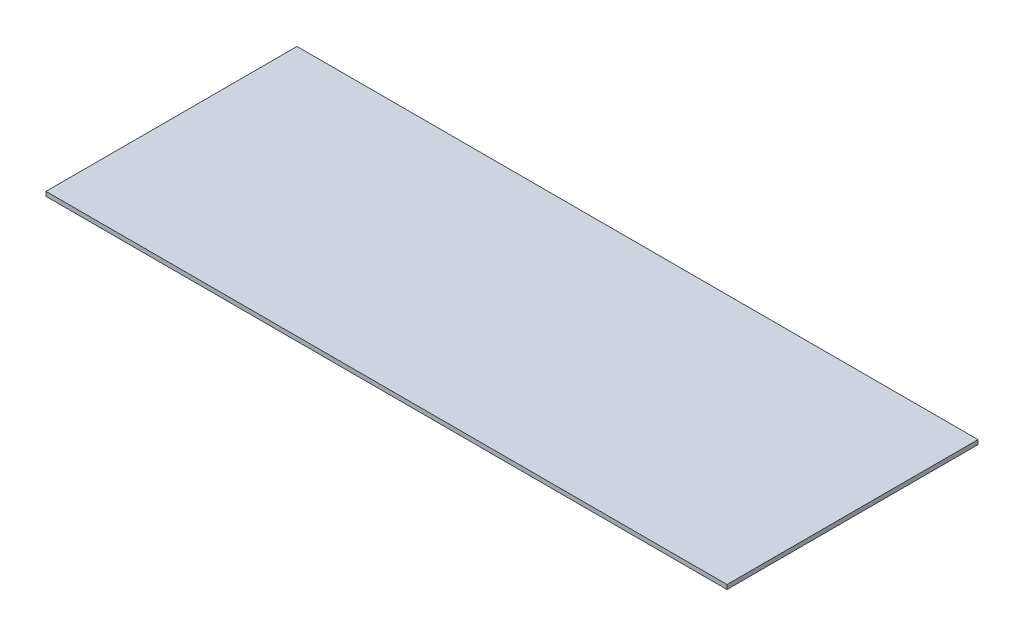
ISO-10303-21;
HEADER;
FILE_DESCRIPTION(('STEP AP214'),'2;1');
FILE_NAME('part.step','',(''),(''),'','','');
FILE_SCHEMA(('AUTOMOTIVE_DESIGN { 1 0 10303 214 1 1 1 1 }'));
ENDSEC;
DATA;
#1=APPLICATION_CONTEXT('core data for automotive mechanical design processes');
#2=APPLICATION_PROTOCOL_DEFINITION('international standard','automotive_design',2000,#1);
#3=PRODUCT_CONTEXT('',#1,'mechanical');
#4=PRODUCT('Part','Part','',(#3));
#5=PRODUCT_RELATED_PRODUCT_CATEGORY('part','',(#4));
#6=PRODUCT_DEFINITION_FORMATION('','',#4);
#7=PRODUCT_DEFINITION_CONTEXT('part definition',#1,'design');
#8=PRODUCT_DEFINITION('design','',#6,#7);
#9=PRODUCT_DEFINITION_SHAPE('','',#8);
#10=(LENGTH_UNIT() NAMED_UNIT(*) SI_UNIT(.MILLI.,.METRE.));
#11=(NAMED_UNIT(*) PLANE_ANGLE_UNIT() SI_UNIT($,.RADIAN.));
#12=(NAMED_UNIT(*) SI_UNIT($,.STERADIAN.) SOLID_ANGLE_UNIT());
#13=UNCERTAINTY_MEASURE_WITH_UNIT(LENGTH_MEASURE(1.E-05),#10,'distance_accuracy_value','');
#14=(GEOMETRIC_REPRESENTATION_CONTEXT(3) GLOBAL_UNCERTAINTY_ASSIGNED_CONTEXT((#13)) GLOBAL_UNIT_ASSIGNED_CONTEXT((#10,
#11,#12)) REPRESENTATION_CONTEXT('',''));
#15=CARTESIAN_POINT('',(0.,0.,0.));
#16=DIRECTION('',(0.,0.,1.));
#17=DIRECTION('',(1.,0.,0.));
#18=AXIS2_PLACEMENT_3D('',#15,#16,#17);
#19=CARTESIAN_POINT('',(0.,2.,0.));
#20=DIRECTION('',(1.,0.,0.));
#21=DIRECTION('',(0.,0.,-1.));
#22=AXIS2_PLACEMENT_3D('',#19,#20,#21);
#23=PLANE('',#22);
#24=DIRECTION('',(0.,0.,1.));
#25=VECTOR('',#24,1.);
#26=CARTESIAN_POINT('',(0.,0.,0.));
#27=LINE('',#26,#25);
#28=CARTESIAN_POINT('',(0.,0.,-115.));
#29=VERTEX_POINT('',#28);
#30=CARTESIAN_POINT('',(0.,0.,0.));
#31=VERTEX_POINT('',#30);
#32=EDGE_CURVE('E107',#29,#31,#27,.T.);
#33=ORIENTED_EDGE('',*,*,#32,.T.);
#34=DIRECTION('',(0.,-1.,0.));
#35=VECTOR('',#34,1.);
#36=CARTESIAN_POINT('',(0.,2.,0.));
#37=LINE('',#36,#35);
#38=CARTESIAN_POINT('',(0.,2.,0.));
#39=VERTEX_POINT('',#38);
#40=EDGE_CURVE('E11',#39,#31,#37,.T.);
#41=ORIENTED_EDGE('',*,*,#40,.F.);
#42=DIRECTION('',(0.,0.,1.));
#43=VECTOR('',#42,1.);
#44=CARTESIAN_POINT('',(0.,2.,0.));
#45=LINE('',#44,#43);
#46=CARTESIAN_POINT('',(0.,2.,-115.));
#47=VERTEX_POINT('',#46);
#48=EDGE_CURVE('E91',#47,#39,#45,.T.);
#49=ORIENTED_EDGE('',*,*,#48,.F.);
#50=DIRECTION('',(0.,-1.,0.));
#51=VECTOR('',#50,1.);
#52=CARTESIAN_POINT('',(0.,2.,-115.));
#53=LINE('',#52,#51);
#54=EDGE_CURVE('E103',#47,#29,#53,.T.);
#55=ORIENTED_EDGE('',*,*,#54,.T.);
#56=EDGE_LOOP('',(#33,#41,#49,#55));
#57=FACE_BOUND('',#56,.T.);
#58=ADVANCED_FACE('F39',(#57),#23,.F.);
#59=CARTESIAN_POINT('',(0.,2.,0.));
#60=DIRECTION('',(0.,0.,-1.));
#61=DIRECTION('',(-1.,0.,0.));
#62=AXIS2_PLACEMENT_3D('',#59,#60,#61);
#63=PLANE('',#62);
#64=DIRECTION('',(1.,0.,0.));
#65=VECTOR('',#64,1.);
#66=CARTESIAN_POINT('',(0.,0.,0.));
#67=LINE('',#66,#65);
#68=CARTESIAN_POINT('',(312.,0.,0.));
#69=VERTEX_POINT('',#68);
#70=EDGE_CURVE('E96',#31,#69,#67,.T.);
#71=ORIENTED_EDGE('',*,*,#70,.T.);
#72=DIRECTION('',(0.,-1.,0.));
#73=VECTOR('',#72,1.);
#74=CARTESIAN_POINT('',(312.,2.,0.));
#75=LINE('',#74,#73);
#76=CARTESIAN_POINT('',(312.,2.,0.));
#77=VERTEX_POINT('',#76);
#78=EDGE_CURVE('E48',#77,#69,#75,.T.);
#79=ORIENTED_EDGE('',*,*,#78,.F.);
#80=DIRECTION('',(1.,0.,0.));
#81=VECTOR('',#80,1.);
#82=CARTESIAN_POINT('',(0.,2.,0.));
#83=LINE('',#82,#81);
#84=EDGE_CURVE('E86',#39,#77,#83,.T.);
#85=ORIENTED_EDGE('',*,*,#84,.F.);
#86=ORIENTED_EDGE('',*,*,#40,.T.);
#87=EDGE_LOOP('',(#71,#79,#85,#86));
#88=FACE_BOUND('',#87,.T.);
#89=ADVANCED_FACE('F95',(#88),#63,.F.);
#90=CARTESIAN_POINT('',(312.,2.,0.));
#91=DIRECTION('',(-1.,0.,0.));
#92=DIRECTION('',(0.,0.,1.));
#93=AXIS2_PLACEMENT_3D('',#90,#91,#92);
#94=PLANE('',#93);
#95=DIRECTION('',(0.,0.,-1.));
#96=VECTOR('',#95,1.);
#97=CARTESIAN_POINT('',(312.,0.,0.));
#98=LINE('',#97,#96);
#99=CARTESIAN_POINT('',(312.,0.,-115.));
#100=VERTEX_POINT('',#99);
#101=EDGE_CURVE('E73',#69,#100,#98,.T.);
#102=ORIENTED_EDGE('',*,*,#101,.T.);
#103=DIRECTION('',(0.,-1.,0.));
#104=VECTOR('',#103,1.);
#105=CARTESIAN_POINT('',(312.,2.,-115.));
#106=LINE('',#105,#104);
#107=CARTESIAN_POINT('',(312.,2.,-115.));
#108=VERTEX_POINT('',#107);
#109=EDGE_CURVE('E98',#108,#100,#106,.T.);
#110=ORIENTED_EDGE('',*,*,#109,.F.);
#111=DIRECTION('',(0.,0.,-1.));
#112=VECTOR('',#111,1.);
#113=CARTESIAN_POINT('',(312.,2.,0.));
#114=LINE('',#113,#112);
#115=EDGE_CURVE('E89',#77,#108,#114,.T.);
#116=ORIENTED_EDGE('',*,*,#115,.F.);
#117=ORIENTED_EDGE('',*,*,#78,.T.);
#118=EDGE_LOOP('',(#102,#110,#116,#117));
#119=FACE_BOUND('',#118,.T.);
#120=ADVANCED_FACE('F99',(#119),#94,.F.);
#121=CARTESIAN_POINT('',(0.,2.,-115.));
#122=DIRECTION('',(0.,0.,1.));
#123=DIRECTION('',(1.,0.,0.));
#124=AXIS2_PLACEMENT_3D('',#121,#122,#123);
#125=PLANE('',#124);
#126=DIRECTION('',(-1.,0.,0.));
#127=VECTOR('',#126,1.);
#128=CARTESIAN_POINT('',(0.,0.,-115.));
#129=LINE('',#128,#127);
#130=EDGE_CURVE('E79',#100,#29,#129,.T.);
#131=ORIENTED_EDGE('',*,*,#130,.T.);
#132=ORIENTED_EDGE('',*,*,#54,.F.);
#133=DIRECTION('',(-1.,0.,0.));
#134=VECTOR('',#133,1.);
#135=CARTESIAN_POINT('',(0.,2.,-115.));
#136=LINE('',#135,#134);
#137=EDGE_CURVE('E56',#108,#47,#136,.T.);
#138=ORIENTED_EDGE('',*,*,#137,.F.);
#139=ORIENTED_EDGE('',*,*,#109,.T.);
#140=EDGE_LOOP('',(#131,#132,#138,#139));
#141=FACE_BOUND('',#140,.T.);
#142=ADVANCED_FACE('F120',(#141),#125,.F.);
#143=CARTESIAN_POINT('',(0.,2.,0.));
#144=DIRECTION('',(0.,-1.,0.));
#145=DIRECTION('',(0.,0.,-1.));
#146=AXIS2_PLACEMENT_3D('',#143,#144,#145);
#147=PLANE('',#146);
#148=ORIENTED_EDGE('',*,*,#48,.T.);
#149=ORIENTED_EDGE('',*,*,#84,.T.);
#150=ORIENTED_EDGE('',*,*,#115,.T.);
#151=ORIENTED_EDGE('',*,*,#137,.T.);
#152=EDGE_LOOP('',(#148,#149,#150,#151));
#153=FACE_BOUND('',#152,.T.);
#154=ADVANCED_FACE('F87',(#153),#147,.F.);
#155=CARTESIAN_POINT('',(0.,0.,0.));
#156=DIRECTION('',(0.,-1.,0.));
#157=DIRECTION('',(0.,0.,-1.));
#158=AXIS2_PLACEMENT_3D('',#155,#156,#157);
#159=PLANE('',#158);
#160=ORIENTED_EDGE('',*,*,#32,.F.);
#161=ORIENTED_EDGE('',*,*,#130,.F.);
#162=ORIENTED_EDGE('',*,*,#101,.F.);
#163=ORIENTED_EDGE('',*,*,#70,.F.);
#164=EDGE_LOOP('',(#160,#161,#162,#163));
#165=FACE_BOUND('',#164,.T.);
#166=ADVANCED_FACE('F123',(#165),#159,.T.);
#167=CLOSED_SHELL('',(#58,#89,#120,#142,#154,#166));
#168=MANIFOLD_SOLID_BREP('B2',#167);
#169=ADVANCED_BREP_SHAPE_REPRESENTATION('',(#18,#168),#14);
#170=SHAPE_DEFINITION_REPRESENTATION(#9,#169);
ENDSEC;
END-ISO-10303-21;
